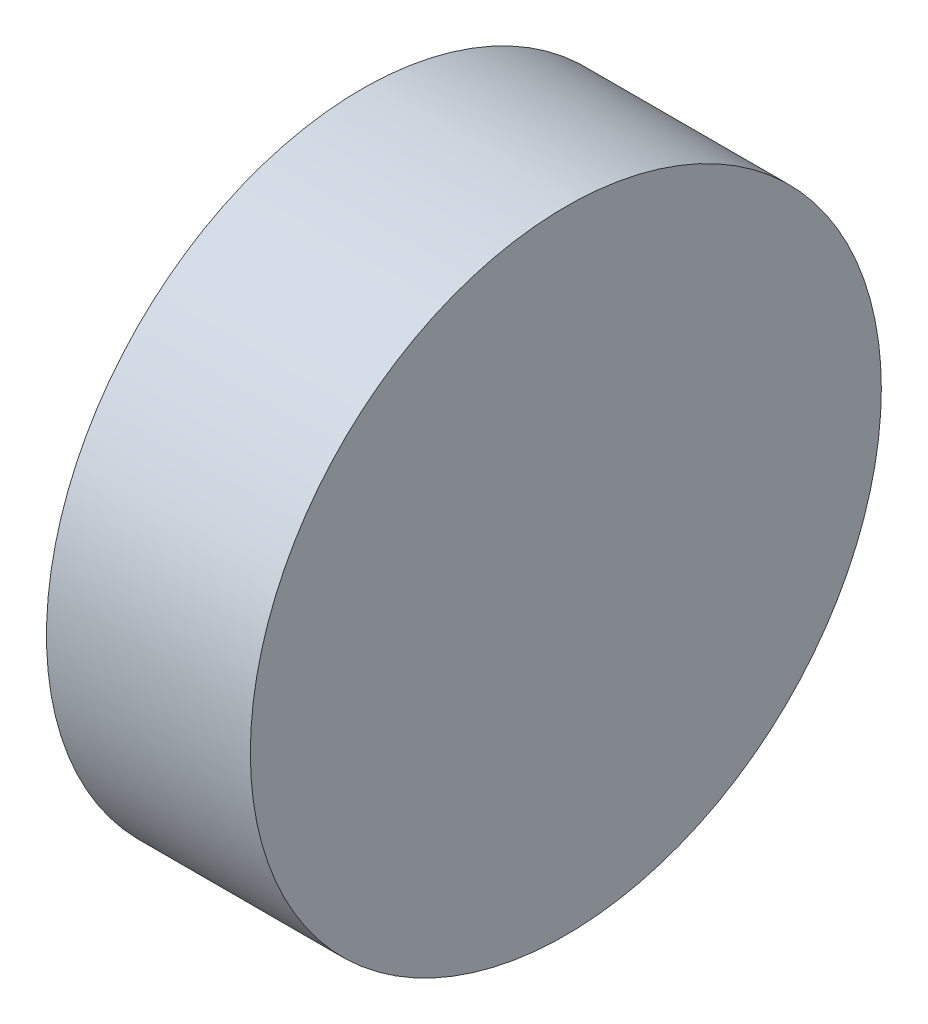
ISO-10303-21;
HEADER;
FILE_DESCRIPTION(('STEP AP214'),'2;1');
FILE_NAME('part.step','',(''),(''),'','','');
FILE_SCHEMA(('AUTOMOTIVE_DESIGN { 1 0 10303 214 1 1 1 1 }'));
ENDSEC;
DATA;
#1=APPLICATION_CONTEXT('core data for automotive mechanical design processes');
#2=APPLICATION_PROTOCOL_DEFINITION('international standard','automotive_design',2000,#1);
#3=PRODUCT_CONTEXT('',#1,'mechanical');
#4=PRODUCT('Part','Part','',(#3));
#5=PRODUCT_RELATED_PRODUCT_CATEGORY('part','',(#4));
#6=PRODUCT_DEFINITION_FORMATION('','',#4);
#7=PRODUCT_DEFINITION_CONTEXT('part definition',#1,'design');
#8=PRODUCT_DEFINITION('design','',#6,#7);
#9=PRODUCT_DEFINITION_SHAPE('','',#8);
#10=(LENGTH_UNIT() NAMED_UNIT(*) SI_UNIT(.MILLI.,.METRE.));
#11=(NAMED_UNIT(*) PLANE_ANGLE_UNIT() SI_UNIT($,.RADIAN.));
#12=(NAMED_UNIT(*) SI_UNIT($,.STERADIAN.) SOLID_ANGLE_UNIT());
#13=UNCERTAINTY_MEASURE_WITH_UNIT(LENGTH_MEASURE(1.E-05),#10,'distance_accuracy_value','');
#14=(GEOMETRIC_REPRESENTATION_CONTEXT(3) GLOBAL_UNCERTAINTY_ASSIGNED_CONTEXT((#13)) GLOBAL_UNIT_ASSIGNED_CONTEXT((#10,
#11,#12)) REPRESENTATION_CONTEXT('',''));
#15=CARTESIAN_POINT('',(0.,0.,0.));
#16=DIRECTION('',(0.,0.,1.));
#17=DIRECTION('',(1.,0.,0.));
#18=AXIS2_PLACEMENT_3D('',#15,#16,#17);
#19=CARTESIAN_POINT('',(4.2,0.,0.));
#20=DIRECTION('',(1.,0.,0.));
#21=DIRECTION('',(0.,0.,-1.));
#22=AXIS2_PLACEMENT_3D('',#19,#20,#21);
#23=PLANE('',#22);
#24=CARTESIAN_POINT('',(4.2,0.,0.));
#25=DIRECTION('',(-1.,0.,0.));
#26=DIRECTION('',(0.,0.,1.));
#27=AXIS2_PLACEMENT_3D('',#24,#25,#26);
#28=CIRCLE('',#27,13.);
#29=CARTESIAN_POINT('',(4.2,0.,13.));
#30=VERTEX_POINT('',#29);
#31=EDGE_CURVE('E150',#30,#30,#28,.T.);
#32=ORIENTED_EDGE('',*,*,#31,.F.);
#33=EDGE_LOOP('',(#32));
#34=FACE_BOUND('',#33,.T.);
#35=ADVANCED_FACE('F17',(#34),#23,.T.);
#36=CARTESIAN_POINT('',(-4.2,0.,0.));
#37=DIRECTION('',(-1.,0.,0.));
#38=DIRECTION('',(0.,0.,1.));
#39=AXIS2_PLACEMENT_3D('',#36,#37,#38);
#40=PLANE('',#39);
#41=CARTESIAN_POINT('',(-4.2,0.,0.));
#42=DIRECTION('',(1.,0.,0.));
#43=DIRECTION('',(0.,0.,-1.));
#44=AXIS2_PLACEMENT_3D('',#41,#42,#43);
#45=CIRCLE('',#44,13.);
#46=CARTESIAN_POINT('',(-4.2,0.,-13.));
#47=VERTEX_POINT('',#46);
#48=EDGE_CURVE('E146',#47,#47,#45,.T.);
#49=ORIENTED_EDGE('',*,*,#48,.F.);
#50=EDGE_LOOP('',(#49));
#51=FACE_BOUND('',#50,.T.);
#52=ADVANCED_FACE('F205',(#51),#40,.T.);
#53=CARTESIAN_POINT('',(-4.2,0.,0.));
#54=DIRECTION('',(1.,0.,0.));
#55=DIRECTION('',(0.,0.,-1.));
#56=AXIS2_PLACEMENT_3D('',#53,#54,#55);
#57=CYLINDRICAL_SURFACE('',#56,13.);
#58=DIRECTION('',(1.,0.,0.));
#59=VECTOR('',#58,1.);
#60=CARTESIAN_POINT('',(-4.2,-10.2,-8.05977667184395));
#61=LINE('',#60,#59);
#62=CARTESIAN_POINT('',(3.95,-10.2,-8.05977667184395));
#63=VERTEX_POINT('',#62);
#64=CARTESIAN_POINT('',(3.2,-10.2,-8.05977667184395));
#65=VERTEX_POINT('',#64);
#66=EDGE_CURVE('E34',#63,#65,#61,.F.);
#67=ORIENTED_EDGE('',*,*,#66,.F.);
#68=CARTESIAN_POINT('',(3.95,0.,0.));
#69=DIRECTION('',(1.,0.,0.));
#70=DIRECTION('',(0.,0.,-1.));
#71=AXIS2_PLACEMENT_3D('',#68,#69,#70);
#72=CIRCLE('',#71,13.);
#73=CARTESIAN_POINT('',(3.95,-9.18477000256403,-9.2));
#74=VERTEX_POINT('',#73);
#75=EDGE_CURVE('E167',#74,#63,#72,.F.);
#76=ORIENTED_EDGE('',*,*,#75,.F.);
#77=DIRECTION('',(1.,0.,0.));
#78=VECTOR('',#77,1.);
#79=CARTESIAN_POINT('',(-4.2,-9.18477000256403,-9.2));
#80=LINE('',#79,#78);
#81=CARTESIAN_POINT('',(-3.95,-9.18477000256403,-9.2));
#82=VERTEX_POINT('',#81);
#83=EDGE_CURVE('E21',#82,#74,#80,.T.);
#84=ORIENTED_EDGE('',*,*,#83,.F.);
#85=CARTESIAN_POINT('',(-3.95,0.,0.));
#86=DIRECTION('',(-1.,0.,0.));
#87=DIRECTION('',(0.,0.,1.));
#88=AXIS2_PLACEMENT_3D('',#85,#86,#87);
#89=CIRCLE('',#88,13.);
#90=CARTESIAN_POINT('',(-3.95,-10.2,-8.05977667184395));
#91=VERTEX_POINT('',#90);
#92=EDGE_CURVE('E11',#91,#82,#89,.F.);
#93=ORIENTED_EDGE('',*,*,#92,.F.);
#94=CARTESIAN_POINT('',(-3.2,-10.2,-8.05977667184395));
#95=VERTEX_POINT('',#94);
#96=EDGE_CURVE('E142',#95,#91,#61,.F.);
#97=ORIENTED_EDGE('',*,*,#96,.F.);
#98=CARTESIAN_POINT('',(-3.2,0.,0.));
#99=DIRECTION('',(-1.,0.,0.));
#100=DIRECTION('',(0.,0.,1.));
#101=AXIS2_PLACEMENT_3D('',#98,#99,#100);
#102=CIRCLE('',#101,13.);
#103=CARTESIAN_POINT('',(-3.2,-10.2,8.05977667184395));
#104=VERTEX_POINT('',#103);
#105=EDGE_CURVE('E158',#104,#95,#102,.F.);
#106=ORIENTED_EDGE('',*,*,#105,.F.);
#107=DIRECTION('',(1.,0.,0.));
#108=VECTOR('',#107,1.);
#109=CARTESIAN_POINT('',(-4.2,-10.2,8.05977667184395));
#110=LINE('',#109,#108);
#111=CARTESIAN_POINT('',(-3.95,-10.2,8.05977667184395));
#112=VERTEX_POINT('',#111);
#113=EDGE_CURVE('E138',#112,#104,#110,.T.);
#114=ORIENTED_EDGE('',*,*,#113,.F.);
#115=CARTESIAN_POINT('',(-3.95,-9.18477000256403,9.2));
#116=VERTEX_POINT('',#115);
#117=EDGE_CURVE('E27',#116,#112,#89,.F.);
#118=ORIENTED_EDGE('',*,*,#117,.F.);
#119=DIRECTION('',(1.,0.,0.));
#120=VECTOR('',#119,1.);
#121=CARTESIAN_POINT('',(-4.2,-9.18477000256403,9.2));
#122=LINE('',#121,#120);
#123=CARTESIAN_POINT('',(3.95,-9.18477000256403,9.2));
#124=VERTEX_POINT('',#123);
#125=EDGE_CURVE('E42',#124,#116,#122,.F.);
#126=ORIENTED_EDGE('',*,*,#125,.F.);
#127=CARTESIAN_POINT('',(3.95,-10.2,8.05977667184395));
#128=VERTEX_POINT('',#127);
#129=EDGE_CURVE('E165',#128,#124,#72,.F.);
#130=ORIENTED_EDGE('',*,*,#129,.F.);
#131=CARTESIAN_POINT('',(3.2,-10.2,8.05977667184395));
#132=VERTEX_POINT('',#131);
#133=EDGE_CURVE('E135',#132,#128,#110,.T.);
#134=ORIENTED_EDGE('',*,*,#133,.F.);
#135=CARTESIAN_POINT('',(3.2,0.,0.));
#136=DIRECTION('',(1.,0.,0.));
#137=DIRECTION('',(0.,0.,-1.));
#138=AXIS2_PLACEMENT_3D('',#135,#136,#137);
#139=CIRCLE('',#138,13.);
#140=EDGE_CURVE('E154',#65,#132,#139,.F.);
#141=ORIENTED_EDGE('',*,*,#140,.F.);
#142=EDGE_LOOP('',(#67,#76,#84,#93,#97,#106,#114,#118,#126,#130,#134,#141));
#143=FACE_BOUND('',#142,.T.);
#144=ORIENTED_EDGE('',*,*,#31,.T.);
#145=EDGE_LOOP('',(#144));
#146=FACE_BOUND('',#145,.T.);
#147=ORIENTED_EDGE('',*,*,#48,.T.);
#148=EDGE_LOOP('',(#147));
#149=FACE_BOUND('',#148,.T.);
#150=ADVANCED_FACE('F19',(#143,#146,#149),#57,.T.);
#151=CARTESIAN_POINT('',(-3.2,-9.,-8.2));
#152=DIRECTION('',(-1.,0.,0.));
#153=DIRECTION('',(0.,0.,1.));
#154=AXIS2_PLACEMENT_3D('',#151,#152,#153);
#155=PLANE('',#154);
#156=ORIENTED_EDGE('',*,*,#105,.T.);
#157=DIRECTION('',(0.,0.,1.));
#158=VECTOR('',#157,1.);
#159=CARTESIAN_POINT('',(-3.2,-10.2,-8.2));
#160=LINE('',#159,#158);
#161=EDGE_CURVE('E141',#95,#104,#160,.T.);
#162=ORIENTED_EDGE('',*,*,#161,.T.);
#163=EDGE_LOOP('',(#156,#162));
#164=FACE_BOUND('',#163,.T.);
#165=ADVANCED_FACE('F186',(#164),#155,.F.);
#166=CARTESIAN_POINT('',(3.2,-9.,-8.2));
#167=DIRECTION('',(1.,0.,0.));
#168=DIRECTION('',(0.,0.,-1.));
#169=AXIS2_PLACEMENT_3D('',#166,#167,#168);
#170=PLANE('',#169);
#171=ORIENTED_EDGE('',*,*,#140,.T.);
#172=DIRECTION('',(0.,0.,-1.));
#173=VECTOR('',#172,1.);
#174=CARTESIAN_POINT('',(3.2,-10.2,-8.2));
#175=LINE('',#174,#173);
#176=EDGE_CURVE('E162',#132,#65,#175,.T.);
#177=ORIENTED_EDGE('',*,*,#176,.T.);
#178=EDGE_LOOP('',(#171,#177));
#179=FACE_BOUND('',#178,.T.);
#180=ADVANCED_FACE('F202',(#179),#170,.F.);
#181=CARTESIAN_POINT('',(0.,-10.2,-9.2));
#182=DIRECTION('',(0.,-1.,0.));
#183=DIRECTION('',(0.,0.,-1.));
#184=AXIS2_PLACEMENT_3D('',#181,#182,#183);
#185=PLANE('',#184);
#186=ORIENTED_EDGE('',*,*,#96,.T.);
#187=DIRECTION('',(0.,0.,1.));
#188=VECTOR('',#187,1.);
#189=CARTESIAN_POINT('',(-3.95,-10.2,-9.2));
#190=LINE('',#189,#188);
#191=EDGE_CURVE('E123',#91,#112,#190,.T.);
#192=ORIENTED_EDGE('',*,*,#191,.T.);
#193=ORIENTED_EDGE('',*,*,#113,.T.);
#194=ORIENTED_EDGE('',*,*,#161,.F.);
#195=EDGE_LOOP('',(#186,#192,#193,#194));
#196=FACE_BOUND('',#195,.T.);
#197=ADVANCED_FACE('F182',(#196),#185,.F.);
#198=CARTESIAN_POINT('',(0.,-5.,9.2));
#199=DIRECTION('',(0.,0.,1.));
#200=DIRECTION('',(1.,0.,0.));
#201=AXIS2_PLACEMENT_3D('',#198,#199,#200);
#202=PLANE('',#201);
#203=ORIENTED_EDGE('',*,*,#125,.T.);
#204=DIRECTION('',(0.,1.,0.));
#205=VECTOR('',#204,1.);
#206=CARTESIAN_POINT('',(-3.95,-5.,9.2));
#207=LINE('',#206,#205);
#208=CARTESIAN_POINT('',(-3.95,0.200000000000001,9.2));
#209=VERTEX_POINT('',#208);
#210=EDGE_CURVE('E132',#116,#209,#207,.T.);
#211=ORIENTED_EDGE('',*,*,#210,.T.);
#212=DIRECTION('',(1.,0.,0.));
#213=VECTOR('',#212,1.);
#214=CARTESIAN_POINT('',(0.,0.200000000000001,9.2));
#215=LINE('',#214,#213);
#216=CARTESIAN_POINT('',(3.95,0.200000000000001,9.2));
#217=VERTEX_POINT('',#216);
#218=EDGE_CURVE('E129',#209,#217,#215,.T.);
#219=ORIENTED_EDGE('',*,*,#218,.T.);
#220=DIRECTION('',(0.,-1.,0.));
#221=VECTOR('',#220,1.);
#222=CARTESIAN_POINT('',(3.95,-5.,9.2));
#223=LINE('',#222,#221);
#224=EDGE_CURVE('E102',#217,#124,#223,.T.);
#225=ORIENTED_EDGE('',*,*,#224,.T.);
#226=EDGE_LOOP('',(#203,#211,#219,#225));
#227=FACE_BOUND('',#226,.T.);
#228=ADVANCED_FACE('F193',(#227),#202,.F.);
#229=ORIENTED_EDGE('',*,*,#66,.T.);
#230=ORIENTED_EDGE('',*,*,#176,.F.);
#231=ORIENTED_EDGE('',*,*,#133,.T.);
#232=DIRECTION('',(0.,0.,1.));
#233=VECTOR('',#232,1.);
#234=CARTESIAN_POINT('',(3.95,-10.2,-9.2));
#235=LINE('',#234,#233);
#236=EDGE_CURVE('E96',#63,#128,#235,.T.);
#237=ORIENTED_EDGE('',*,*,#236,.F.);
#238=EDGE_LOOP('',(#229,#230,#231,#237));
#239=FACE_BOUND('',#238,.T.);
#240=ADVANCED_FACE('F195',(#239),#185,.F.);
#241=CARTESIAN_POINT('',(-3.95,-5.,-9.2));
#242=DIRECTION('',(-1.,0.,0.));
#243=DIRECTION('',(0.,0.,1.));
#244=AXIS2_PLACEMENT_3D('',#241,#242,#243);
#245=PLANE('',#244);
#246=ORIENTED_EDGE('',*,*,#117,.T.);
#247=ORIENTED_EDGE('',*,*,#191,.F.);
#248=ORIENTED_EDGE('',*,*,#92,.T.);
#249=DIRECTION('',(0.,-1.,0.));
#250=VECTOR('',#249,1.);
#251=CARTESIAN_POINT('',(-3.95,-5.,-9.2));
#252=LINE('',#251,#250);
#253=CARTESIAN_POINT('',(-3.95,0.200000000000001,-9.2));
#254=VERTEX_POINT('',#253);
#255=EDGE_CURVE('E111',#254,#82,#252,.T.);
#256=ORIENTED_EDGE('',*,*,#255,.F.);
#257=DIRECTION('',(0.,0.,1.));
#258=VECTOR('',#257,1.);
#259=CARTESIAN_POINT('',(-3.95,0.200000000000001,-9.2));
#260=LINE('',#259,#258);
#261=EDGE_CURVE('E106',#254,#209,#260,.T.);
#262=ORIENTED_EDGE('',*,*,#261,.T.);
#263=ORIENTED_EDGE('',*,*,#210,.F.);
#264=EDGE_LOOP('',(#246,#247,#248,#256,#262,#263));
#265=FACE_BOUND('',#264,.T.);
#266=ADVANCED_FACE('F189',(#265),#245,.F.);
#267=CARTESIAN_POINT('',(0.,0.200000000000001,-9.2));
#268=DIRECTION('',(0.,1.,0.));
#269=DIRECTION('',(0.,0.,1.));
#270=AXIS2_PLACEMENT_3D('',#267,#268,#269);
#271=PLANE('',#270);
#272=ORIENTED_EDGE('',*,*,#261,.F.);
#273=DIRECTION('',(-1.,0.,0.));
#274=VECTOR('',#273,1.);
#275=CARTESIAN_POINT('',(0.,0.200000000000001,-9.2));
#276=LINE('',#275,#274);
#277=CARTESIAN_POINT('',(3.95,0.200000000000001,-9.2));
#278=VERTEX_POINT('',#277);
#279=EDGE_CURVE('E90',#278,#254,#276,.T.);
#280=ORIENTED_EDGE('',*,*,#279,.F.);
#281=DIRECTION('',(0.,0.,1.));
#282=VECTOR('',#281,1.);
#283=CARTESIAN_POINT('',(3.95,0.200000000000001,-9.2));
#284=LINE('',#283,#282);
#285=EDGE_CURVE('E100',#278,#217,#284,.T.);
#286=ORIENTED_EDGE('',*,*,#285,.T.);
#287=ORIENTED_EDGE('',*,*,#218,.F.);
#288=EDGE_LOOP('',(#272,#280,#286,#287));
#289=FACE_BOUND('',#288,.T.);
#290=ADVANCED_FACE('F108',(#289),#271,.F.);
#291=CARTESIAN_POINT('',(0.,-5.,-9.2));
#292=DIRECTION('',(0.,0.,-1.));
#293=DIRECTION('',(-1.,0.,0.));
#294=AXIS2_PLACEMENT_3D('',#291,#292,#293);
#295=PLANE('',#294);
#296=ORIENTED_EDGE('',*,*,#83,.T.);
#297=DIRECTION('',(0.,1.,0.));
#298=VECTOR('',#297,1.);
#299=CARTESIAN_POINT('',(3.95,-5.,-9.2));
#300=LINE('',#299,#298);
#301=EDGE_CURVE('E85',#74,#278,#300,.T.);
#302=ORIENTED_EDGE('',*,*,#301,.T.);
#303=ORIENTED_EDGE('',*,*,#279,.T.);
#304=ORIENTED_EDGE('',*,*,#255,.T.);
#305=EDGE_LOOP('',(#296,#302,#303,#304));
#306=FACE_BOUND('',#305,.T.);
#307=ADVANCED_FACE('F87',(#306),#295,.F.);
#308=CARTESIAN_POINT('',(3.95,-5.,-9.2));
#309=DIRECTION('',(1.,0.,0.));
#310=DIRECTION('',(0.,0.,-1.));
#311=AXIS2_PLACEMENT_3D('',#308,#309,#310);
#312=PLANE('',#311);
#313=ORIENTED_EDGE('',*,*,#75,.T.);
#314=ORIENTED_EDGE('',*,*,#236,.T.);
#315=ORIENTED_EDGE('',*,*,#129,.T.);
#316=ORIENTED_EDGE('',*,*,#224,.F.);
#317=ORIENTED_EDGE('',*,*,#285,.F.);
#318=ORIENTED_EDGE('',*,*,#301,.F.);
#319=EDGE_LOOP('',(#313,#314,#315,#316,#317,#318));
#320=FACE_BOUND('',#319,.T.);
#321=ADVANCED_FACE('F101',(#320),#312,.F.);
#322=CLOSED_SHELL('',(#35,#52,#150,#165,#180,#197,#228,#240,#266,#290,#307,#321));
#323=MANIFOLD_SOLID_BREP('B1',#322);
#324=ADVANCED_BREP_SHAPE_REPRESENTATION('',(#18,#323),#14);
#325=SHAPE_DEFINITION_REPRESENTATION(#9,#324);
ENDSEC;
END-ISO-10303-21;
